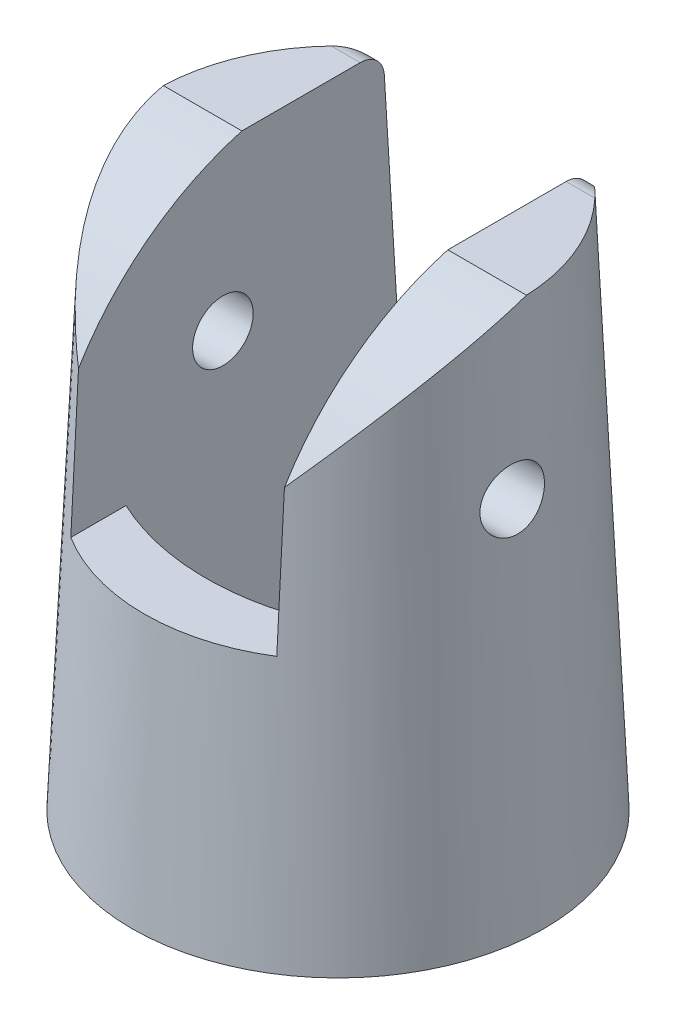
ISO-10303-21;
HEADER;
FILE_DESCRIPTION(('STEP AP214'),'2;1');
FILE_NAME('part.step','',(''),(''),'','','');
FILE_SCHEMA(('AUTOMOTIVE_DESIGN { 1 0 10303 214 1 1 1 1 }'));
ENDSEC;
DATA;
#1=APPLICATION_CONTEXT('core data for automotive mechanical design processes');
#2=APPLICATION_PROTOCOL_DEFINITION('international standard','automotive_design',2000,#1);
#3=PRODUCT_CONTEXT('',#1,'mechanical');
#4=PRODUCT('Part','Part','',(#3));
#5=PRODUCT_RELATED_PRODUCT_CATEGORY('part','',(#4));
#6=PRODUCT_DEFINITION_FORMATION('','',#4);
#7=PRODUCT_DEFINITION_CONTEXT('part definition',#1,'design');
#8=PRODUCT_DEFINITION('design','',#6,#7);
#9=PRODUCT_DEFINITION_SHAPE('','',#8);
#10=(LENGTH_UNIT() NAMED_UNIT(*) SI_UNIT(.MILLI.,.METRE.));
#11=(NAMED_UNIT(*) PLANE_ANGLE_UNIT() SI_UNIT($,.RADIAN.));
#12=(NAMED_UNIT(*) SI_UNIT($,.STERADIAN.) SOLID_ANGLE_UNIT());
#13=UNCERTAINTY_MEASURE_WITH_UNIT(LENGTH_MEASURE(1.E-05),#10,'distance_accuracy_value','');
#14=(GEOMETRIC_REPRESENTATION_CONTEXT(3) GLOBAL_UNCERTAINTY_ASSIGNED_CONTEXT((#13)) GLOBAL_UNIT_ASSIGNED_CONTEXT((#10,
#11,#12)) REPRESENTATION_CONTEXT('',''));
#15=CARTESIAN_POINT('',(0.,0.,0.));
#16=DIRECTION('',(0.,0.,1.));
#17=DIRECTION('',(1.,0.,0.));
#18=AXIS2_PLACEMENT_3D('',#15,#16,#17);
#19=CARTESIAN_POINT('',(-4.25,11.,10.));
#20=DIRECTION('',(0.,1.,0.));
#21=DIRECTION('',(0.,0.,1.));
#22=AXIS2_PLACEMENT_3D('',#19,#20,#21);
#23=PLANE('',#22);
#24=CARTESIAN_POINT('',(0.,11.,-4.55193349511584));
#25=DIRECTION('',(0.,1.,0.));
#26=DIRECTION('',(0.,0.,1.));
#27=AXIS2_PLACEMENT_3D('',#24,#25,#26);
#28=CIRCLE('',#27,10.);
#29=CARTESIAN_POINT('',(-4.25,11.,4.5));
#30=VERTEX_POINT('',#29);
#31=CARTESIAN_POINT('',(4.25,11.,4.5));
#32=VERTEX_POINT('',#31);
#33=EDGE_CURVE('E168',#30,#32,#28,.T.);
#34=ORIENTED_EDGE('',*,*,#33,.F.);
#35=DIRECTION('',(0.,0.,-1.));
#36=VECTOR('',#35,1.);
#37=CARTESIAN_POINT('',(-4.25,11.,10.));
#38=LINE('',#37,#36);
#39=CARTESIAN_POINT('',(-4.25,11.,6.77772085586298));
#40=VERTEX_POINT('',#39);
#41=EDGE_CURVE('E232',#40,#30,#38,.T.);
#42=ORIENTED_EDGE('',*,*,#41,.F.);
#43=CARTESIAN_POINT('',(0.,11.,0.));
#44=DIRECTION('',(0.,1.,0.));
#45=DIRECTION('',(0.,0.,1.));
#46=AXIS2_PLACEMENT_3D('',#43,#44,#45);
#47=CIRCLE('',#46,8.);
#48=CARTESIAN_POINT('',(4.25,11.,6.77772085586298));
#49=VERTEX_POINT('',#48);
#50=EDGE_CURVE('E339',#49,#40,#47,.F.);
#51=ORIENTED_EDGE('',*,*,#50,.F.);
#52=DIRECTION('',(0.,0.,-1.));
#53=VECTOR('',#52,1.);
#54=CARTESIAN_POINT('',(4.25,11.,10.));
#55=LINE('',#54,#53);
#56=EDGE_CURVE('E228',#49,#32,#55,.T.);
#57=ORIENTED_EDGE('',*,*,#56,.T.);
#58=EDGE_LOOP('',(#34,#42,#51,#57));
#59=FACE_BOUND('',#58,.T.);
#60=ADVANCED_FACE('F36',(#59),#23,.T.);
#61=CARTESIAN_POINT('',(0.,22.,0.));
#62=DIRECTION('',(0.,1.,0.));
#63=DIRECTION('',(0.,0.,1.));
#64=AXIS2_PLACEMENT_3D('',#61,#62,#63);
#65=PLANE('',#64);
#66=DIRECTION('',(0.,0.,-1.));
#67=VECTOR('',#66,1.);
#68=CARTESIAN_POINT('',(-4.25,22.,0.));
#69=LINE('',#68,#67);
#70=CARTESIAN_POINT('',(-4.25,22.,-0.282780766378372));
#71=VERTEX_POINT('',#70);
#72=CARTESIAN_POINT('',(-4.25,22.,-5.16422596730198));
#73=VERTEX_POINT('',#72);
#74=EDGE_CURVE('E242',#71,#73,#69,.T.);
#75=ORIENTED_EDGE('',*,*,#74,.T.);
#76=DIRECTION('',(1.,0.,0.));
#77=VECTOR('',#76,1.);
#78=CARTESIAN_POINT('',(-4.35658145321195,22.,-5.16422596730198));
#79=LINE('',#78,#77);
#80=CARTESIAN_POINT('',(-5.438821816591,22.,-5.16422557510443));
#81=VERTEX_POINT('',#80);
#82=EDGE_CURVE('E12',#73,#81,#79,.F.);
#83=ORIENTED_EDGE('',*,*,#82,.T.);
#84=CARTESIAN_POINT('',(0.,22.,0.));
#85=DIRECTION('',(0.,1.,0.));
#86=DIRECTION('',(0.,0.,1.));
#87=AXIS2_PLACEMENT_3D('',#84,#85,#86);
#88=CIRCLE('',#87,7.5);
#89=CARTESIAN_POINT('',(-7.49466710656093,22.,-0.282780766378366));
#90=VERTEX_POINT('',#89);
#91=EDGE_CURVE('E265',#81,#90,#88,.T.);
#92=ORIENTED_EDGE('',*,*,#91,.T.);
#93=DIRECTION('',(-1.,0.,0.));
#94=VECTOR('',#93,1.);
#95=CARTESIAN_POINT('',(10.,22.,-0.282780766378372));
#96=LINE('',#95,#94);
#97=EDGE_CURVE('E222',#71,#90,#96,.T.);
#98=ORIENTED_EDGE('',*,*,#97,.F.);
#99=EDGE_LOOP('',(#75,#83,#92,#98));
#100=FACE_BOUND('',#99,.T.);
#101=ADVANCED_FACE('F300',(#100),#65,.T.);
#102=CARTESIAN_POINT('',(7.49466710656093,22.,-0.282780766378372));
#103=VERTEX_POINT('',#102);
#104=CARTESIAN_POINT('',(5.43882208829554,22.,-5.16422548309984));
#105=VERTEX_POINT('',#104);
#106=EDGE_CURVE('E261',#103,#105,#88,.T.);
#107=ORIENTED_EDGE('',*,*,#106,.T.);
#108=DIRECTION('',(1.,0.,0.));
#109=VECTOR('',#108,1.);
#110=CARTESIAN_POINT('',(4.25,22.,-5.16422596730198));
#111=LINE('',#110,#109);
#112=CARTESIAN_POINT('',(4.25,22.,-5.16422596730198));
#113=VERTEX_POINT('',#112);
#114=EDGE_CURVE('E249',#105,#113,#111,.F.);
#115=ORIENTED_EDGE('',*,*,#114,.T.);
#116=DIRECTION('',(0.,0.,1.));
#117=VECTOR('',#116,1.);
#118=CARTESIAN_POINT('',(4.25,22.,0.));
#119=LINE('',#118,#117);
#120=CARTESIAN_POINT('',(4.25,22.,-0.282780766378372));
#121=VERTEX_POINT('',#120);
#122=EDGE_CURVE('E234',#113,#121,#119,.T.);
#123=ORIENTED_EDGE('',*,*,#122,.T.);
#124=DIRECTION('',(-1.,0.,0.));
#125=VECTOR('',#124,1.);
#126=CARTESIAN_POINT('',(10.,22.,-0.282780766378372));
#127=LINE('',#126,#125);
#128=EDGE_CURVE('E184',#103,#121,#127,.T.);
#129=ORIENTED_EDGE('',*,*,#128,.F.);
#130=EDGE_LOOP('',(#107,#115,#123,#129));
#131=FACE_BOUND('',#130,.T.);
#132=ADVANCED_FACE('F306',(#131),#65,.T.);
#133=CARTESIAN_POINT('',(0.,22.,0.));
#134=DIRECTION('',(0.,-1.,0.));
#135=DIRECTION('',(0.,0.,-1.));
#136=AXIS2_PLACEMENT_3D('',#133,#134,#135);
#137=CONICAL_SURFACE('',#136,7.5,0.0454232794215771);
#138=CARTESIAN_POINT('',(-7.83796735688722,14.3622174893562,-0.379967166316534));
#139=CARTESIAN_POINT('',(-7.84258137245685,14.3133454888,-0.330657672658893));
#140=CARTESIAN_POINT('',(-7.84674066486493,14.2685433740009,-0.277221256144544));
#141=CARTESIAN_POINT('',(-7.8535770197042,14.1883770300518,-0.163551374229647));
#142=CARTESIAN_POINT('',(-7.85625291943775,14.1530202154338,-0.103312621478255));
#143=CARTESIAN_POINT('',(-7.8596375423327,14.0927931436459,0.0222748852102689));
#144=CARTESIAN_POINT('',(-7.86034581452373,14.067925291601,0.0876248070735859));
#145=CARTESIAN_POINT('',(-7.85946228431654,14.0294247957157,0.221525428298114));
#146=CARTESIAN_POINT('',(-7.85787100492778,14.0157895982304,0.290075396410402));
#147=CARTESIAN_POINT('',(-7.85228410719661,14.0001840444117,0.427766064798723));
#148=CARTESIAN_POINT('',(-7.84831020572619,13.9981100486801,0.496895934210147));
#149=CARTESIAN_POINT('',(-7.83806545214515,14.0053392217948,0.634384128941268));
#150=CARTESIAN_POINT('',(-7.83179450336468,14.014642869501,0.702742421664802));
#151=CARTESIAN_POINT('',(-7.81722601313375,14.0443276298967,0.837049248229589));
#152=CARTESIAN_POINT('',(-7.80892100022893,14.0647499293699,0.902987843329569));
#153=CARTESIAN_POINT('',(-7.790775888944,14.1160446525726,1.03043929857791));
#154=CARTESIAN_POINT('',(-7.78093560413196,14.1469183459746,1.09195161990537));
#155=CARTESIAN_POINT('',(-7.76010966108363,14.2190054175936,1.21024682770151));
#156=CARTESIAN_POINT('',(-7.74910385329152,14.2604277357386,1.26689885331061));
#157=CARTESIAN_POINT('',(-7.72687097524336,14.3521248730564,1.37247369304183));
#158=CARTESIAN_POINT('',(-7.71564387723456,14.4024008089463,1.42139553066781));
#159=CARTESIAN_POINT('',(-7.69356264148555,14.5114011926656,1.51095465792816));
#160=CARTESIAN_POINT('',(-7.68271790805299,14.5702531136188,1.55143935878097));
#161=CARTESIAN_POINT('',(-7.6623986074272,14.6941689491704,1.62188693084612));
#162=CARTESIAN_POINT('',(-7.65292397084745,14.7592325489103,1.65185033500368));
#163=CARTESIAN_POINT('',(-7.63612434840078,14.8931135922155,1.70006025493109));
#164=CARTESIAN_POINT('',(-7.628779504597,14.9618887622122,1.71841702637262));
#165=CARTESIAN_POINT('',(-7.61663038843077,15.1017712667087,1.74320996212474));
#166=CARTESIAN_POINT('',(-7.61182564575986,15.1728781668894,1.74964833372071));
#167=CARTESIAN_POINT('',(-7.60511802104365,15.3134015003158,1.75031471224994));
#168=CARTESIAN_POINT('',(-7.60314193334666,15.3828130458677,1.74486034008846));
#169=CARTESIAN_POINT('',(-7.60185272747497,15.5197905645542,1.72250877153392));
#170=CARTESIAN_POINT('',(-7.60253942022953,15.5873566683814,1.70561238765126));
#171=CARTESIAN_POINT('',(-7.60630351713635,15.7179091624343,1.66114648990012));
#172=CARTESIAN_POINT('',(-7.60935259794971,15.7809402068652,1.63370535133399));
#173=CARTESIAN_POINT('',(-7.61736988938797,15.9015696424095,1.5689454281796));
#174=CARTESIAN_POINT('',(-7.62233823791652,15.9591676427765,1.53162593387021));
#175=CARTESIAN_POINT('',(-7.63370221314921,16.0681355426512,1.44760265700419));
#176=CARTESIAN_POINT('',(-7.64011600940821,16.1194120265777,1.40078023978353));
#177=CARTESIAN_POINT('',(-7.65367838854403,16.2134837982302,1.29936472333884));
#178=CARTESIAN_POINT('',(-7.66082704856748,16.2562781941154,1.24477080802427));
#179=CARTESIAN_POINT('',(-7.67534091282203,16.3329515652811,1.12822611342176));
#180=CARTESIAN_POINT('',(-7.68270769514751,16.3666553047501,1.06616013918209));
#181=CARTESIAN_POINT('',(-7.69691604657131,16.423165976049,0.937193488415529));
#182=CARTESIAN_POINT('',(-7.70375760872745,16.4459727638678,0.870292748007196));
#183=CARTESIAN_POINT('',(-7.71644262030627,16.4800561197651,0.73334943158845));
#184=CARTESIAN_POINT('',(-7.72228364732094,16.4913050247458,0.663299734651518));
#185=CARTESIAN_POINT('',(-7.73262752673949,16.5018027282445,0.522209650757891));
#186=CARTESIAN_POINT('',(-7.73713045599583,16.5010522160741,0.451169320942772));
#187=CARTESIAN_POINT('',(-7.74464533464226,16.4875918161016,0.310815334039046));
#188=CARTESIAN_POINT('',(-7.74767065771755,16.4749923395032,0.241491793203629));
#189=CARTESIAN_POINT('',(-7.7523770032345,16.4383254425338,0.105900144542275));
#190=CARTESIAN_POINT('',(-7.75405805542838,16.4142582759914,0.0396319691237624));
#191=CARTESIAN_POINT('',(-7.75633448543182,16.3554710465647,-0.0876438503397964));
#192=CARTESIAN_POINT('',(-7.75693482435448,16.3208005225005,-0.148674301814935));
#193=CARTESIAN_POINT('',(-7.75745954559994,16.2417479395246,-0.264086768502954));
#194=CARTESIAN_POINT('',(-7.75738391180716,16.1973656491035,-0.318468625178237));
#195=CARTESIAN_POINT('',(-7.75702698900383,16.0999847315327,-0.419211339047032));
#196=CARTESIAN_POINT('',(-7.75674504948525,16.0469592633596,-0.465546250063089));
#197=CARTESIAN_POINT('',(-7.75646152768906,15.9338912875552,-0.548673610293639));
#198=CARTESIAN_POINT('',(-7.75645994636058,15.873848756169,-0.585466027202548));
#199=CARTESIAN_POINT('',(-7.75716824579797,15.7483571213731,-0.648511138791821));
#200=CARTESIAN_POINT('',(-7.75787915678735,15.6829003149688,-0.674748494466434));
#201=CARTESIAN_POINT('',(-7.76032771935512,15.5485315888061,-0.715859664595585));
#202=CARTESIAN_POINT('',(-7.76206531536022,15.4796198562436,-0.730734094012506));
#203=CARTESIAN_POINT('',(-7.76670676584568,15.3405207125203,-0.748683187532378));
#204=CARTESIAN_POINT('',(-7.76960720822943,15.2703376022251,-0.751792098543693));
#205=CARTESIAN_POINT('',(-7.77652868962862,15.130481192041,-0.74623974442389));
#206=CARTESIAN_POINT('',(-7.78054994377231,15.0608079926616,-0.737576218456636));
#207=CARTESIAN_POINT('',(-7.78948146542229,14.9238460238463,-0.708730903239069));
#208=CARTESIAN_POINT('',(-7.79439304167692,14.8565609413452,-0.688532062131407));
#209=CARTESIAN_POINT('',(-7.80469362494343,14.7263866758636,-0.637196842199327));
#210=CARTESIAN_POINT('',(-7.8100822334847,14.6634939010552,-0.606069528773817));
#211=CARTESIAN_POINT('',(-7.8193813436165,14.5597286320879,-0.543391023811535));
#212=CARTESIAN_POINT('',(-7.82330433193733,14.5174439551711,-0.514147846605545));
#213=CARTESIAN_POINT('',(-7.83089031896814,14.4367692624713,-0.450678665707523));
#214=CARTESIAN_POINT('',(-7.83455331694851,14.3983792576176,-0.416452648032943));
#215=CARTESIAN_POINT('',(-7.83796735688722,14.3622174893562,-0.379967166316534));
#216=B_SPLINE_CURVE_WITH_KNOTS('',3,(#138,#139,#140,#141,#142,#143,#144,#145,#146,#147,#148,
#149,#150,#151,#152,#153,#154,#155,#156,#157,#158,#159,#160,#161,#162,#163,#164,#165,#166,#167,
#168,#169,#170,#171,#172,#173,#174,#175,#176,#177,#178,#179,#180,#181,#182,#183,#184,#185,#186,
#187,#188,#189,#190,#191,#192,#193,#194,#195,#196,#197,#198,#199,#200,#201,#202,#203,#204,#205,
#206,#207,#208,#209,#210,#211,#212,#213,#214,#215),.UNSPECIFIED.,.T.,.F.,(4,2,2,2,2,2,2,2,2,2,2,
2,2,2,2,2,2,2,2,2,2,2,2,2,2,2,2,2,2,2,2,2,2,2,2,2,2,2,4),(0.,0.208553037536982,
0.417269310681503,0.626033416602672,0.834750048737337,1.04159261254212,1.24844388219199,
1.45606665596537,1.66371466154781,1.87584802928522,2.08800817283941,2.30372407188203,
2.5194290424861,2.73305288682505,2.94663716410913,3.1545872325207,3.36252253570734,
3.56800270522751,3.77349764170112,3.98173607251478,4.18999638674758,4.40202316410761,
4.61405274347573,4.82658862900881,5.03911230536931,5.24967505863844,5.46023315147819,
5.66982216909493,5.87941618344591,6.08967393764611,6.29993240365298,6.51049533073528,
6.72104686132943,6.93098504794489,7.14096355781078,7.3512532707934,7.56136895456365,
7.7156827817969,7.86999704206467),.UNSPECIFIED.);
#217=CARTESIAN_POINT('',(-7.83796735688722,14.3622174893562,-0.379967166316534));
#218=VERTEX_POINT('',#217);
#219=EDGE_CURVE('E516',#218,#218,#216,.T.);
#220=ORIENTED_EDGE('',*,*,#219,.F.);
#221=EDGE_LOOP('',(#220));
#222=FACE_BOUND('',#221,.T.);
#223=CARTESIAN_POINT('',(7.83796735688722,14.3622174893562,-0.379967166316534));
#224=CARTESIAN_POINT('',(7.83328744997076,14.411786493911,-0.429972551895008));
#225=CARTESIAN_POINT('',(7.82813491145327,14.4655970435523,-0.475788374346395));
#226=CARTESIAN_POINT('',(7.81750342359286,14.5801753249335,-0.557736154925303));
#227=CARTESIAN_POINT('',(7.81202413824418,14.6409502797276,-0.593857926863399));
#228=CARTESIAN_POINT('',(7.80132350845169,14.7677115943127,-0.655359958784006));
#229=CARTESIAN_POINT('',(7.79610206849342,14.8336960004513,-0.68074422306178));
#230=CARTESIAN_POINT('',(7.78639291034306,14.9690294601727,-0.720049024368096));
#231=CARTESIAN_POINT('',(7.78190500745661,15.0383776610788,-0.733972450649715));
#232=CARTESIAN_POINT('',(7.77399091836468,15.1783689326216,-0.749929222930623));
#233=CARTESIAN_POINT('',(7.77056291818221,15.2490095693085,-0.751982991142016));
#234=CARTESIAN_POINT('',(7.76489197262361,15.3896780692755,-0.744167192422135));
#235=CARTESIAN_POINT('',(7.76264903265032,15.4597059297606,-0.73429757113135));
#236=CARTESIAN_POINT('',(7.75929248978818,15.5967220156707,-0.702993570327684));
#237=CARTESIAN_POINT('',(7.75817236040506,15.6637256196513,-0.681627146744598));
#238=CARTESIAN_POINT('',(7.75679365361985,15.7932173640281,-0.627974577793197));
#239=CARTESIAN_POINT('',(7.75653508331722,15.8557054672114,-0.5956883424456));
#240=CARTESIAN_POINT('',(7.75649444526569,15.9744166240331,-0.521095827758257));
#241=CARTESIAN_POINT('',(7.7567125622039,16.0306372405351,-0.478785670425266));
#242=CARTESIAN_POINT('',(7.75715624655791,16.1351989223126,-0.38534680301936));
#243=CARTESIAN_POINT('',(7.75738181406936,16.1835398863793,-0.334217979693814));
#244=CARTESIAN_POINT('',(7.75735277244982,16.2710823014537,-0.224452008036307));
#245=CARTESIAN_POINT('',(7.75709699967637,16.31026134601,-0.165796984553421));
#246=CARTESIAN_POINT('',(7.75566157635508,16.3782114671868,-0.0427503856031519));
#247=CARTESIAN_POINT('',(7.75448195024235,16.406982819052,0.0216410381015896));
#248=CARTESIAN_POINT('',(7.75087513937824,16.4532417161059,0.154138010703878));
#249=CARTESIAN_POINT('',(7.74845117341741,16.4707581130484,0.222233573597008));
#250=CARTESIAN_POINT('',(7.74219359590397,16.4941450998807,0.360331220773845));
#251=CARTESIAN_POINT('',(7.73836001268759,16.5000159238554,0.430333266707118));
#252=CARTESIAN_POINT('',(7.72932068479677,16.4999840438097,0.570093595387191));
#253=CARTESIAN_POINT('',(7.72411787249586,16.4941063254208,0.639852080057968));
#254=CARTESIAN_POINT('',(7.71255950790742,16.4708408417028,0.777323498526293));
#255=CARTESIAN_POINT('',(7.70620390189043,16.4534525397877,0.845036336808613));
#256=CARTESIAN_POINT('',(7.69269658051719,16.4075370442686,0.976990666341749));
#257=CARTESIAN_POINT('',(7.68553992325761,16.3789376360297,1.04120651486163));
#258=CARTESIAN_POINT('',(7.67101803808324,16.3114123472423,1.16393536511896));
#259=CARTESIAN_POINT('',(7.66365279507404,16.2724857176454,1.22244795276949));
#260=CARTESIAN_POINT('',(7.64930430545073,16.1849979103186,1.33262702154622));
#261=CARTESIAN_POINT('',(7.64232472712915,16.1363596199086,1.38423279897497));
#262=CARTESIAN_POINT('',(7.62951784340339,16.0309808458313,1.4785542987219));
#263=CARTESIAN_POINT('',(7.62369050222643,15.9742406137942,1.52127029703761));
#264=CARTESIAN_POINT('',(7.61388677149647,15.8546071582144,1.59631412815498));
#265=CARTESIAN_POINT('',(7.60989910971896,15.7917543426828,1.62870483824421));
#266=CARTESIAN_POINT('',(7.60426405732497,15.6614026873648,1.68246189666889));
#267=CARTESIAN_POINT('',(7.60261632102336,15.5939045353947,1.70382987313305));
#268=CARTESIAN_POINT('',(7.60201413428632,15.4576064065578,1.73457894238311));
#269=CARTESIAN_POINT('',(7.60300775882109,15.3888575301053,1.74418579213573));
#270=CARTESIAN_POINT('',(7.60767099089208,15.2508115759145,1.75190966695364));
#271=CARTESIAN_POINT('',(7.61134043696361,15.1815145315033,1.75002738524674));
#272=CARTESIAN_POINT('',(7.62115557547188,15.0449328497942,1.73496140239145));
#273=CARTESIAN_POINT('',(7.62728047676171,14.9776362883151,1.72187156798986));
#274=CARTESIAN_POINT('',(7.6416294406344,14.8462855334842,1.68497664018864));
#275=CARTESIAN_POINT('',(7.64985369677373,14.7822316397532,1.66117055861715));
#276=CARTESIAN_POINT('',(7.66801243401358,14.6579498642628,1.6030701895091));
#277=CARTESIAN_POINT('',(7.6779742216434,14.5978081122334,1.56860035291659));
#278=CARTESIAN_POINT('',(7.69881665045785,14.4841316963163,1.49030840998256));
#279=CARTESIAN_POINT('',(7.70969743522397,14.4305980680908,1.44648484060131));
#280=CARTESIAN_POINT('',(7.73191396506617,14.3302369345709,1.34942943943223));
#281=CARTESIAN_POINT('',(7.74325425905537,14.2836130542963,1.29598786361171));
#282=CARTESIAN_POINT('',(7.76532822275802,14.200004007431,1.18191600547704));
#283=CARTESIAN_POINT('',(7.77606186415307,14.1630192905038,1.12128538798862));
#284=CARTESIAN_POINT('',(7.79623886870943,14.0996284747101,0.994176429544855));
#285=CARTESIAN_POINT('',(7.80567632874684,14.073269780279,0.927673462984205));
#286=CARTESIAN_POINT('',(7.82259046158376,14.0322318910173,0.790920827608197));
#287=CARTESIAN_POINT('',(7.83006744861704,14.017550823674,0.720671761410059));
#288=CARTESIAN_POINT('',(7.84250930031314,14.0005847034211,0.579912298187302));
#289=CARTESIAN_POINT('',(7.84752147606881,13.9980572854591,0.509435309955935));
#290=CARTESIAN_POINT('',(7.85506980203676,14.0049041647396,0.3689156843286));
#291=CARTESIAN_POINT('',(7.85760577766391,14.0142793010676,0.298873077904731));
#292=CARTESIAN_POINT('',(7.86022591507369,14.0444071543172,0.162619905603529));
#293=CARTESIAN_POINT('',(7.86035508572819,14.0649435994135,0.096362149741156));
#294=CARTESIAN_POINT('',(7.85853055532961,14.1166536842147,-0.0317812303583431));
#295=CARTESIAN_POINT('',(7.85657877647283,14.1478174892377,-0.0936708332501011));
#296=CARTESIAN_POINT('',(7.85185318686241,14.2090525709101,-0.193735923866125));
#297=CARTESIAN_POINT('',(7.84950029916606,14.2366587523309,-0.233464626389801));
#298=CARTESIAN_POINT('',(7.844161430126,14.2962513658329,-0.309440878422375));
#299=CARTESIAN_POINT('',(7.84117544129214,14.3282378497355,-0.345688386738222));
#300=CARTESIAN_POINT('',(7.83796735688722,14.3622174893562,-0.379967166316534));
#301=B_SPLINE_CURVE_WITH_KNOTS('',3,(#223,#224,#225,#226,#227,#228,#229,#230,#231,#232,#233,
#234,#235,#236,#237,#238,#239,#240,#241,#242,#243,#244,#245,#246,#247,#248,#249,#250,#251,#252,
#253,#254,#255,#256,#257,#258,#259,#260,#261,#262,#263,#264,#265,#266,#267,#268,#269,#270,#271,
#272,#273,#274,#275,#276,#277,#278,#279,#280,#281,#282,#283,#284,#285,#286,#287,#288,#289,#290,
#291,#292,#293,#294,#295,#296,#297,#298,#299,#300),.UNSPECIFIED.,.T.,.F.,(4,2,2,2,2,2,2,2,2,2,2,
2,2,2,2,2,2,2,2,2,2,2,2,2,2,2,2,2,2,2,2,2,2,2,2,2,2,2,4),(0.,0.211521205247813,
0.423263807442014,0.634927375558793,0.846537567380181,1.0577835669305,1.26903052956875,
1.47904234258002,1.68905588613143,1.89915081148957,2.10924843516682,2.31985462343067,
2.53045524153484,2.74051381413052,2.95056816434615,3.16017626716106,3.36979414190905,
3.58078503094666,3.79179122764584,4.00454472861511,4.2172916233229,4.4287170558575,
4.6401112505464,4.84738064458982,5.05463753259738,5.26017537178874,5.46573216802022,
5.67487122393724,5.8840430157978,6.09850004920052,6.31296708515513,6.52838057854262,
6.74375952331146,6.95482510378299,7.16590556441396,7.37303463285966,7.57997253949852,
7.72496898140106,7.86996713883852),.UNSPECIFIED.);
#302=CARTESIAN_POINT('',(7.83796735688722,14.3622174893562,-0.379967166316534));
#303=VERTEX_POINT('',#302);
#304=EDGE_CURVE('E510',#303,#303,#301,.T.);
#305=ORIENTED_EDGE('',*,*,#304,.F.);
#306=EDGE_LOOP('',(#305));
#307=FACE_BOUND('',#306,.T.);
#308=CARTESIAN_POINT('',(0.,41.3966504623758,-4.91858206978573));
#309=DIRECTION('',(0.,-0.061048539534854,0.998134798421867));
#310=DIRECTION('',(0.,-0.998134798421867,-0.061048539534854));
#311=AXIS2_PLACEMENT_3D('',#308,#309,#310);
#312=ELLIPSE('',#311,108.411013929554,4.42830625448101);
#313=CARTESIAN_POINT('',(4.34940519150883,21.0610485395348,-6.16236076572385));
#314=VERTEX_POINT('',#313);
#315=CARTESIAN_POINT('',(4.25,11.,-6.77772085586298));
#316=VERTEX_POINT('',#315);
#317=EDGE_CURVE('E170',#314,#316,#312,.F.);
#318=ORIENTED_EDGE('',*,*,#317,.F.);
#319=CARTESIAN_POINT('',(4.34940519150883,21.0610485395349,-6.16236076572385));
#320=CARTESIAN_POINT('',(4.34960668817625,21.0960037714882,-6.16026639709529));
#321=CARTESIAN_POINT('',(4.35255770840583,21.1307027635223,-6.15626033932825));
#322=CARTESIAN_POINT('',(4.36323729220071,21.1984264149009,-6.14492437754313));
#323=CARTESIAN_POINT('',(4.37091464928772,21.2314649684895,-6.13763032047632));
#324=CARTESIAN_POINT('',(4.3927674187493,21.3034159998716,-6.11798905969393));
#325=CARTESIAN_POINT('',(4.40808163224176,21.3417552703831,-6.10483757135849));
#326=CARTESIAN_POINT('',(4.44349099131189,21.4147941627066,-6.07500114310349));
#327=CARTESIAN_POINT('',(4.46360781026385,21.4494762264571,-6.05830022381533));
#328=CARTESIAN_POINT('',(4.51834985809759,21.5317973235916,-6.01298583576456));
#329=CARTESIAN_POINT('',(4.55514250711387,21.5770255303745,-5.98264043640866));
#330=CARTESIAN_POINT('',(4.63324615227983,21.6597061595097,-5.91759225288077));
#331=CARTESIAN_POINT('',(4.67456645627655,21.6971420868919,-5.8828804698848));
#332=CARTESIAN_POINT('',(4.78221980236055,21.7828896509989,-5.79100629877273));
#333=CARTESIAN_POINT('',(4.8503074683537,21.8266110984243,-5.73161575598004));
#334=CARTESIAN_POINT('',(4.98881469902542,21.8995032525744,-5.60704864762353));
#335=CARTESIAN_POINT('',(5.05923576587386,21.9286643838315,-5.54186830754522));
#336=CARTESIAN_POINT('',(5.18172123590552,21.9668930634414,-5.4247129010371));
#337=CARTESIAN_POINT('',(5.23375859656191,21.9792240430582,-5.37375512147988));
#338=CARTESIAN_POINT('',(5.33701405608624,21.9957402272397,-5.27015891537571));
#339=CARTESIAN_POINT('',(5.38823463353786,21.9999585068014,-5.21752820599083));
#340=CARTESIAN_POINT('',(5.43882157834542,21.9999999999995,-5.16422499886717));
#341=B_SPLINE_CURVE_WITH_KNOTS('',3,(#319,#320,#321,#322,#323,#324,#325,#326,#327,#328,#329,
#330,#331,#332,#333,#334,#335,#336,#337,#338,#339,#340),.UNSPECIFIED.,.F.,.F.,(4,2,2,2,2,2,2,2,
2,2,4),(0.,0.104713635229163,0.208312266464569,0.337583019397058,0.467448560866493,
0.663534383733636,0.860031158880604,1.15956187798788,1.45928932231263,1.6804477134348,
1.9007025274968),.UNSPECIFIED.);
#342=EDGE_CURVE('E252',#314,#105,#341,.T.);
#343=ORIENTED_EDGE('',*,*,#342,.T.);
#344=ORIENTED_EDGE('',*,*,#106,.F.);
#345=CARTESIAN_POINT('',(3.92629643649929,16.4998,6.68182888151938));
#346=CARTESIAN_POINT('',(4.01931564514,16.6087596912144,6.62142155513562));
#347=CARTESIAN_POINT('',(4.11131934328455,16.7173930395185,6.55888032044954));
#348=CARTESIAN_POINT('',(4.2932260178552,16.9338412713703,6.42945464521689));
#349=CARTESIAN_POINT('',(4.38312886202439,17.0416561031024,6.36256993222782));
#350=CARTESIAN_POINT('',(4.64974442688335,17.3638214077866,6.15515905521457));
#351=CARTESIAN_POINT('',(4.82317510446661,17.5766708748424,6.00799843905382));
#352=CARTESIAN_POINT('',(5.16169686386746,17.9988471466584,5.69400575303419));
#353=CARTESIAN_POINT('',(5.32669369672939,18.208121685456,5.52700099956619));
#354=CARTESIAN_POINT('',(5.64481535638337,18.6193198754499,5.17407572809778));
#355=CARTESIAN_POINT('',(5.79794544197142,18.8212467614988,4.98816367438537));
#356=CARTESIAN_POINT('',(6.18554186312356,19.344583308023,4.46948304084846));
#357=CARTESIAN_POINT('',(6.40828324022354,19.6584689169281,4.11972189091382));
#358=CARTESIAN_POINT('',(6.70460657922282,20.1030052689049,3.55584345351292));
#359=CARTESIAN_POINT('',(6.79701231639435,20.2466767825226,3.36154965453657));
#360=CARTESIAN_POINT('',(6.96755426977346,20.5240954336224,2.95998057341705));
#361=CARTESIAN_POINT('',(7.04569416904946,20.6578451273514,2.7527086604966));
#362=CARTESIAN_POINT('',(7.17256638181405,20.8899099716306,2.36580838957839));
#363=CARTESIAN_POINT('',(7.22406541289287,20.9901763018322,2.18825189066998));
#364=CARTESIAN_POINT('',(7.31510853322135,21.1822314807992,1.82566056472446));
#365=CARTESIAN_POINT('',(7.35465549431912,21.2740223623616,1.64062754628174));
#366=CARTESIAN_POINT('',(7.42056862050664,21.4481005988231,1.26431410365367));
#367=CARTESIAN_POINT('',(7.44696120414356,21.5304067445339,1.0730470299074));
#368=CARTESIAN_POINT('',(7.48555616887137,21.6848871796944,0.68514833352627));
#369=CARTESIAN_POINT('',(7.49776772335813,21.757067992397,0.48852026316183));
#370=CARTESIAN_POINT('',(7.50462208608418,21.8557629190509,0.195068954102029));
#371=CARTESIAN_POINT('',(7.50510898755003,21.8864428593324,0.0997400677496214));
#372=CARTESIAN_POINT('',(7.50253793378852,21.9452762371562,-0.0915936069798442));
#373=CARTESIAN_POINT('',(7.49948176524655,21.9734309404044,-0.187598030443378));
#374=CARTESIAN_POINT('',(7.49461138166237,22.0003080623876,-0.28388412339532));
#375=B_SPLINE_CURVE_WITH_KNOTS('',3,(#345,#346,#347,#348,#349,#350,#351,#352,#353,#354,#355,
#356,#357,#358,#359,#360,#361,#362,#363,#364,#365,#366,#367,#368,#369,#370,#371,#372,#373,#374),
.UNSPECIFIED.,.F.,.F.,(4,2,2,2,2,2,2,2,2,2,2,2,2,2,4),(0.,0.466403210186573,0.932835703589585,
1.86664716605778,2.8092792869606,3.75149125909967,5.30530822586806,6.08073041777247,
6.85595213185147,7.48631450141871,8.11652528662495,8.74546523819607,9.37399811531518,
9.67435061674296,9.97455172345294),.UNSPECIFIED.);
#376=CARTESIAN_POINT('',(4.25,16.8824851749416,6.45993994327909));
#377=VERTEX_POINT('',#376);
#378=EDGE_CURVE('E182',#377,#103,#375,.T.);
#379=ORIENTED_EDGE('',*,*,#378,.F.);
#380=CARTESIAN_POINT('',(4.24999999999999,28.8057765116834,5.80024977110232));
#381=CARTESIAN_POINT('',(4.24999999999999,26.2989672472569,5.9414803133123));
#382=CARTESIAN_POINT('',(4.25,23.7920608816099,6.08097461329277));
#383=CARTESIAN_POINT('',(4.25,18.7780890989142,6.35703244550604));
#384=CARTESIAN_POINT('',(4.25,16.2710236820206,6.49359598055445));
#385=CARTESIAN_POINT('',(4.25,11.2567649375485,6.76433422535382));
#386=CARTESIAN_POINT('',(4.25,8.74957161001142,6.89850893587335));
#387=CARTESIAN_POINT('',(4.25,3.73507492544163,7.16483292436775));
#388=CARTESIAN_POINT('',(4.25,1.22777156830585,7.29698220040266));
#389=CARTESIAN_POINT('',(4.25,-1.27957505847372,7.42830030504297));
#390=B_SPLINE_CURVE_WITH_KNOTS('',3,(#380,#381,#382,#383,#384,#385,#386,#387,#388,#389),
.UNSPECIFIED.,.F.,.F.,(4,2,2,2,4),(0.,7.5323518408429,15.0646964449593,22.5970386255993,
30.129388020287),.UNSPECIFIED.);
#391=EDGE_CURVE('E344',#377,#49,#390,.T.);
#392=ORIENTED_EDGE('',*,*,#391,.T.);
#393=ORIENTED_EDGE('',*,*,#50,.T.);
#394=CARTESIAN_POINT('',(-4.25,-1.27957505847371,7.42830030504297));
#395=CARTESIAN_POINT('',(-4.25,1.22777156830585,7.29698220040253));
#396=CARTESIAN_POINT('',(-4.25,3.73507492544163,7.16483292436767));
#397=CARTESIAN_POINT('',(-4.25,8.74957161001142,6.89850893587343));
#398=CARTESIAN_POINT('',(-4.25,11.2567649375485,6.764334225354));
#399=CARTESIAN_POINT('',(-4.25,16.2710236820206,6.49359598055463));
#400=CARTESIAN_POINT('',(-4.25,18.7780890989142,6.35703244550611));
#401=CARTESIAN_POINT('',(-4.25,23.7920608816099,6.08097461329268));
#402=CARTESIAN_POINT('',(-4.25000000000001,26.2989672472569,5.94148031331217));
#403=CARTESIAN_POINT('',(-4.25,28.8057765116834,5.80024977110231));
#404=B_SPLINE_CURVE_WITH_KNOTS('',3,(#394,#395,#396,#397,#398,#399,#400,#401,#402,#403),
.UNSPECIFIED.,.F.,.F.,(4,2,2,2,4),(0.,7.53234939468772,15.0646915753277,22.5970361794441,
30.129388020287),.UNSPECIFIED.);
#405=CARTESIAN_POINT('',(-4.25,16.8824851749416,6.45993994327909));
#406=VERTEX_POINT('',#405);
#407=EDGE_CURVE('E337',#40,#406,#404,.T.);
#408=ORIENTED_EDGE('',*,*,#407,.T.);
#409=CARTESIAN_POINT('',(-7.49461138166237,22.0003080623876,-0.28388412339532));
#410=CARTESIAN_POINT('',(-7.49988309951068,21.9712190846278,-0.179671951668641));
#411=CARTESIAN_POINT('',(-7.50302890185525,21.9406327300934,-0.0757903670246975));
#412=CARTESIAN_POINT('',(-7.50517997220749,21.876530339592,0.13109451540663));
#413=CARTESIAN_POINT('',(-7.50418576359576,21.8430146744732,0.234097922563612));
#414=CARTESIAN_POINT('',(-7.49516957751024,21.7382570709262,0.54121921764491));
#415=CARTESIAN_POINT('',(-7.48112808840113,21.6627231332624,0.743739635876401));
#416=CARTESIAN_POINT('',(-7.43828077256935,21.5017611807683,1.14094177768584));
#417=CARTESIAN_POINT('',(-7.40961241381115,21.4164309208909,1.33567859826578));
#418=CARTESIAN_POINT('',(-7.33878245591829,21.2361607157852,1.71816731631631));
#419=CARTESIAN_POINT('',(-7.29661717605367,21.1412181540315,1.90591729280399));
#420=CARTESIAN_POINT('',(-7.20026737266868,20.9431335214884,2.27261940341223));
#421=CARTESIAN_POINT('',(-7.1461407509817,20.8400324372421,2.45160901155736));
#422=CARTESIAN_POINT('',(-7.02698361077534,20.6261840787999,2.80110168903546));
#423=CARTESIAN_POINT('',(-6.96195399000715,20.5154374345796,2.97160545559348));
#424=CARTESIAN_POINT('',(-6.75179546283551,20.1723044580087,3.47084807264812));
#425=CARTESIAN_POINT('',(-6.59184775246264,19.9295259920633,3.78640217377691));
#426=CARTESIAN_POINT('',(-6.27814664729068,19.476767736348,4.31768661392711));
#427=CARTESIAN_POINT('',(-6.13025157024551,19.2707265163302,4.54040677859332));
#428=CARTESIAN_POINT('',(-5.81823735113368,18.8479886062566,4.96354041807549));
#429=CARTESIAN_POINT('',(-5.65410913328027,18.6312859899342,5.16394127976161));
#430=CARTESIAN_POINT('',(-5.31234904088311,18.1896276284259,5.54273628503243));
#431=CARTESIAN_POINT('',(-5.13471803279778,17.9646724132781,5.72113183874884));
#432=CARTESIAN_POINT('',(-4.76799729772391,17.5085184045354,6.05655537735724));
#433=CARTESIAN_POINT('',(-4.57891334851169,17.2773227911971,6.21359400873509));
#434=CARTESIAN_POINT('',(-4.30977503143093,16.9537346128282,6.41700145308093));
#435=CARTESIAN_POINT('',(-4.23399982905615,16.8632054471757,6.47215899836824));
#436=CARTESIAN_POINT('',(-4.08115145722696,16.6817932779821,6.57931295355229));
#437=CARTESIAN_POINT('',(-4.00408158775142,16.5909115269953,6.63131618955329));
#438=CARTESIAN_POINT('',(-3.92629643649941,16.4997999999999,6.68182888151944));
#439=B_SPLINE_CURVE_WITH_KNOTS('',3,(#409,#410,#411,#412,#413,#414,#415,#416,#417,#418,#419,
#420,#421,#422,#423,#424,#425,#426,#427,#428,#429,#430,#431,#432,#433,#434,#435,#436,#437,#438),
.UNSPECIFIED.,.F.,.F.,(4,2,2,2,2,2,2,2,2,2,2,2,2,2,4),(0.,0.324904791494705,0.649768509741711,
1.29859079449086,1.94142458372872,2.58443382900467,3.22439607689719,3.8643056562566,
5.14731722375654,6.15868823098563,7.17062791680593,8.18250272235386,9.19387124187545,
9.58475718585292,9.97476460463198),.UNSPECIFIED.);
#440=EDGE_CURVE('E220',#90,#406,#439,.T.);
#441=ORIENTED_EDGE('',*,*,#440,.F.);
#442=ORIENTED_EDGE('',*,*,#91,.F.);
#443=CARTESIAN_POINT('',(-5.43882140354224,21.9999999999997,-5.16422518296511));
#444=CARTESIAN_POINT('',(-5.40122433759026,21.999988003325,-5.20383005545125));
#445=CARTESIAN_POINT('',(-5.363273983719,21.9976475021436,-5.24307901185124));
#446=CARTESIAN_POINT('',(-5.28693546590571,21.9884676916384,-5.32063117425542));
#447=CARTESIAN_POINT('',(-5.24854721730837,21.9816274974216,-5.35893419269737));
#448=CARTESIAN_POINT('',(-5.17127647154873,21.9635269369551,-5.43467828088518));
#449=CARTESIAN_POINT('',(-5.13239260596844,21.9522280107373,-5.47210873056732));
#450=CARTESIAN_POINT('',(-5.05479542039122,21.9252776384547,-5.54552571918466));
#451=CARTESIAN_POINT('',(-5.01608206782365,21.9096270638205,-5.58151254556044));
#452=CARTESIAN_POINT('',(-4.91611870549029,21.8632611799505,-5.67291560545297));
#453=CARTESIAN_POINT('',(-4.85525150425467,21.8291362822063,-5.72706601404808));
#454=CARTESIAN_POINT('',(-4.73700759106297,21.7490533016696,-5.82992881193552));
#455=CARTESIAN_POINT('',(-4.67961922184138,21.7031377874961,-5.8786598784777));
#456=CARTESIAN_POINT('',(-4.59414942754881,21.619557864228,-5.95022715826893));
#457=CARTESIAN_POINT('',(-4.56374880396903,21.5863107740471,-5.97544919517086));
#458=CARTESIAN_POINT('',(-4.50666004104456,21.5146667784949,-6.02268787020086));
#459=CARTESIAN_POINT('',(-4.47996861603082,21.4762744908226,-6.04470734602655));
#460=CARTESIAN_POINT('',(-4.4376145251762,21.403376261858,-6.07994105728665));
#461=CARTESIAN_POINT('',(-4.4208227260574,21.369953905225,-6.09402052716762));
#462=CARTESIAN_POINT('',(-4.39183504171262,21.3000849240776,-6.11885386930183));
#463=CARTESIAN_POINT('',(-4.37962334642295,21.2636492430545,-6.12961915827847));
#464=CARTESIAN_POINT('',(-4.36374806339614,21.1994932868563,-6.1445024636423));
#465=CARTESIAN_POINT('',(-4.35862572076484,21.1723707491004,-6.14964452883512));
#466=CARTESIAN_POINT('',(-4.35153841039485,21.1172304633356,-6.15772915553273));
#467=CARTESIAN_POINT('',(-4.34959278287488,21.0892082831502,-6.16065818627183));
#468=CARTESIAN_POINT('',(-4.34940519150883,21.0610485395349,-6.16236076572385));
#469=B_SPLINE_CURVE_WITH_KNOTS('',3,(#443,#444,#445,#446,#447,#448,#449,#450,#451,#452,#453,
#454,#455,#456,#457,#458,#459,#460,#461,#462,#463,#464,#465,#466,#467,#468),.UNSPECIFIED.,.F.,
.F.,(4,2,2,2,2,2,2,2,2,2,2,2,4),(0.,0.163752003230833,0.327536218961529,0.492769055887859,
0.657968828250649,0.92206694623714,1.18522465633728,1.33975800572197,1.49415358224955,
1.61364458887856,1.73271924287742,1.81668582207121,1.90116171903801),.UNSPECIFIED.);
#470=CARTESIAN_POINT('',(-4.34940519150883,21.0610485395349,-6.16236076572385));
#471=VERTEX_POINT('',#470);
#472=EDGE_CURVE('E385',#81,#471,#469,.T.);
#473=ORIENTED_EDGE('',*,*,#472,.T.);
#474=CARTESIAN_POINT('',(-4.25,11.,-6.77772085586298));
#475=VERTEX_POINT('',#474);
#476=EDGE_CURVE('E179',#475,#471,#312,.F.);
#477=ORIENTED_EDGE('',*,*,#476,.F.);
#478=EDGE_CURVE('E331',#475,#316,#47,.F.);
#479=ORIENTED_EDGE('',*,*,#478,.T.);
#480=EDGE_LOOP('',(#318,#343,#344,#379,#392,#393,#408,#441,#442,#473,#477,#479));
#481=FACE_BOUND('',#480,.T.);
#482=CARTESIAN_POINT('',(0.,0.,0.));
#483=DIRECTION('',(0.,1.,0.));
#484=DIRECTION('',(0.,0.,1.));
#485=AXIS2_PLACEMENT_3D('',#482,#483,#484);
#486=CIRCLE('',#485,8.5);
#487=CARTESIAN_POINT('',(0.,0.,8.5));
#488=VERTEX_POINT('',#487);
#489=EDGE_CURVE('E264',#488,#488,#486,.T.);
#490=ORIENTED_EDGE('',*,*,#489,.T.);
#491=EDGE_LOOP('',(#490));
#492=FACE_BOUND('',#491,.T.);
#493=ADVANCED_FACE('F194',(#222,#307,#481,#492),#137,.T.);
#494=CARTESIAN_POINT('',(0.,0.,0.));
#495=DIRECTION('',(0.,1.,0.));
#496=DIRECTION('',(0.,0.,1.));
#497=AXIS2_PLACEMENT_3D('',#494,#495,#496);
#498=PLANE('',#497);
#499=DIRECTION('',(0.,0.,-1.));
#500=VECTOR('',#499,1.);
#501=CARTESIAN_POINT('',(-4.25,0.,4.5));
#502=LINE('',#501,#500);
#503=CARTESIAN_POINT('',(-4.25,0.,4.5));
#504=VERTEX_POINT('',#503);
#505=CARTESIAN_POINT('',(-4.25,0.,-4.5));
#506=VERTEX_POINT('',#505);
#507=EDGE_CURVE('E148',#504,#506,#502,.T.);
#508=ORIENTED_EDGE('',*,*,#507,.F.);
#509=CARTESIAN_POINT('',(0.,0.,-4.55193349511584));
#510=DIRECTION('',(0.,-1.,0.));
#511=DIRECTION('',(0.,0.,1.));
#512=AXIS2_PLACEMENT_3D('',#509,#510,#511);
#513=CIRCLE('',#512,10.);
#514=CARTESIAN_POINT('',(4.25,0.,4.5));
#515=VERTEX_POINT('',#514);
#516=EDGE_CURVE('E153',#515,#504,#513,.T.);
#517=ORIENTED_EDGE('',*,*,#516,.F.);
#518=DIRECTION('',(0.,0.,1.));
#519=VECTOR('',#518,1.);
#520=CARTESIAN_POINT('',(4.25,0.,4.5));
#521=LINE('',#520,#519);
#522=CARTESIAN_POINT('',(4.25,0.,-4.5));
#523=VERTEX_POINT('',#522);
#524=EDGE_CURVE('E158',#523,#515,#521,.T.);
#525=ORIENTED_EDGE('',*,*,#524,.F.);
#526=CARTESIAN_POINT('',(0.,0.,4.55193349511584));
#527=DIRECTION('',(0.,-1.,0.));
#528=DIRECTION('',(0.,0.,1.));
#529=AXIS2_PLACEMENT_3D('',#526,#527,#528);
#530=CIRCLE('',#529,10.);
#531=EDGE_CURVE('E137',#506,#523,#530,.T.);
#532=ORIENTED_EDGE('',*,*,#531,.F.);
#533=EDGE_LOOP('',(#508,#517,#525,#532));
#534=FACE_BOUND('',#533,.T.);
#535=ORIENTED_EDGE('',*,*,#489,.F.);
#536=EDGE_LOOP('',(#535));
#537=FACE_BOUND('',#536,.T.);
#538=ADVANCED_FACE('F155',(#534,#537),#498,.F.);
#539=CARTESIAN_POINT('',(-4.25000000000001,35.609106296612,10.));
#540=DIRECTION('',(1.,0.,0.));
#541=DIRECTION('',(0.,1.,0.));
#542=AXIS2_PLACEMENT_3D('',#539,#540,#541);
#543=PLANE('',#542);
#544=CARTESIAN_POINT('',(-4.25000000000001,15.25,0.5));
#545=DIRECTION('',(1.,0.,0.));
#546=DIRECTION('',(0.,1.,0.));
#547=AXIS2_PLACEMENT_3D('',#544,#545,#546);
#548=CIRCLE('',#547,1.25);
#549=CARTESIAN_POINT('',(-4.25000000000001,16.5,0.5));
#550=VERTEX_POINT('',#549);
#551=EDGE_CURVE('E525',#550,#550,#548,.T.);
#552=ORIENTED_EDGE('',*,*,#551,.F.);
#553=EDGE_LOOP('',(#552));
#554=FACE_BOUND('',#553,.T.);
#555=DIRECTION('',(0.,-0.998134798421867,-0.061048539534854));
#556=VECTOR('',#555,1.);
#557=CARTESIAN_POINT('',(-4.25000000000001,36.5397349355926,-5.21564374925335));
#558=LINE('',#557,#556);
#559=CARTESIAN_POINT('',(-4.25,21.0610485395349,-6.16236076572385));
#560=VERTEX_POINT('',#559);
#561=EDGE_CURVE('E173',#560,#475,#558,.T.);
#562=ORIENTED_EDGE('',*,*,#561,.F.);
#563=CARTESIAN_POINT('',(-4.25,21.,-5.16422596730198));
#564=DIRECTION('',(1.,0.,0.));
#565=DIRECTION('',(0.,1.,0.));
#566=AXIS2_PLACEMENT_3D('',#563,#564,#565);
#567=CIRCLE('',#566,1.);
#568=EDGE_CURVE('E46',#560,#73,#567,.T.);
#569=ORIENTED_EDGE('',*,*,#568,.T.);
#570=ORIENTED_EDGE('',*,*,#74,.F.);
#571=CARTESIAN_POINT('',(-4.25,10.9237834170715,-3.37590640366814));
#572=DIRECTION('',(1.,0.,0.));
#573=DIRECTION('',(0.,1.,0.));
#574=AXIS2_PLACEMENT_3D('',#571,#572,#573);
#575=CIRCLE('',#574,11.5);
#576=EDGE_CURVE('E395',#406,#71,#575,.F.);
#577=ORIENTED_EDGE('',*,*,#576,.F.);
#578=ORIENTED_EDGE('',*,*,#407,.F.);
#579=ORIENTED_EDGE('',*,*,#41,.T.);
#580=DIRECTION('',(0.,-1.,0.));
#581=VECTOR('',#580,1.);
#582=CARTESIAN_POINT('',(-4.25,14.,4.5));
#583=LINE('',#582,#581);
#584=EDGE_CURVE('E144',#30,#504,#583,.T.);
#585=ORIENTED_EDGE('',*,*,#584,.T.);
#586=ORIENTED_EDGE('',*,*,#507,.T.);
#587=DIRECTION('',(0.,-1.,0.));
#588=VECTOR('',#587,1.);
#589=CARTESIAN_POINT('',(-4.25,14.,-4.5));
#590=LINE('',#589,#588);
#591=CARTESIAN_POINT('',(-4.25,11.,-4.5));
#592=VERTEX_POINT('',#591);
#593=EDGE_CURVE('E133',#592,#506,#590,.T.);
#594=ORIENTED_EDGE('',*,*,#593,.F.);
#595=EDGE_CURVE('E231',#592,#475,#38,.T.);
#596=ORIENTED_EDGE('',*,*,#595,.T.);
#597=EDGE_LOOP('',(#562,#569,#570,#577,#578,#579,#585,#586,#594,#596));
#598=FACE_BOUND('',#597,.T.);
#599=ADVANCED_FACE('F149',(#554,#598),#543,.T.);
#600=CARTESIAN_POINT('',(0.,11.,4.55193349511584));
#601=DIRECTION('',(0.,1.,0.));
#602=DIRECTION('',(0.,0.,1.));
#603=AXIS2_PLACEMENT_3D('',#600,#601,#602);
#604=CIRCLE('',#603,10.);
#605=CARTESIAN_POINT('',(4.25,11.,-4.5));
#606=VERTEX_POINT('',#605);
#607=EDGE_CURVE('E140',#606,#592,#604,.T.);
#608=ORIENTED_EDGE('',*,*,#607,.F.);
#609=EDGE_CURVE('E225',#606,#316,#55,.T.);
#610=ORIENTED_EDGE('',*,*,#609,.T.);
#611=ORIENTED_EDGE('',*,*,#478,.F.);
#612=ORIENTED_EDGE('',*,*,#595,.F.);
#613=EDGE_LOOP('',(#608,#610,#611,#612));
#614=FACE_BOUND('',#613,.T.);
#615=ADVANCED_FACE('F302',(#614),#23,.T.);
#616=CARTESIAN_POINT('',(4.24999999999999,35.609106296612,10.));
#617=DIRECTION('',(-1.,0.,0.));
#618=DIRECTION('',(0.,-1.,0.));
#619=AXIS2_PLACEMENT_3D('',#616,#617,#618);
#620=PLANE('',#619);
#621=CARTESIAN_POINT('',(4.24999999999999,15.25,0.5));
#622=DIRECTION('',(-1.,0.,0.));
#623=DIRECTION('',(0.,-1.,0.));
#624=AXIS2_PLACEMENT_3D('',#621,#622,#623);
#625=CIRCLE('',#624,1.25);
#626=CARTESIAN_POINT('',(4.24999999999999,14.,0.5));
#627=VERTEX_POINT('',#626);
#628=EDGE_CURVE('E41',#627,#627,#625,.T.);
#629=ORIENTED_EDGE('',*,*,#628,.F.);
#630=EDGE_LOOP('',(#629));
#631=FACE_BOUND('',#630,.T.);
#632=ORIENTED_EDGE('',*,*,#122,.F.);
#633=CARTESIAN_POINT('',(4.25,21.,-5.16422596730198));
#634=DIRECTION('',(-1.,0.,0.));
#635=DIRECTION('',(0.,-1.,0.));
#636=AXIS2_PLACEMENT_3D('',#633,#634,#635);
#637=CIRCLE('',#636,1.);
#638=CARTESIAN_POINT('',(4.25,21.0610485395349,-6.16236076572385));
#639=VERTEX_POINT('',#638);
#640=EDGE_CURVE('E251',#113,#639,#637,.T.);
#641=ORIENTED_EDGE('',*,*,#640,.T.);
#642=DIRECTION('',(0.,0.998134798421867,0.061048539534854));
#643=VECTOR('',#642,1.);
#644=CARTESIAN_POINT('',(4.24999999999999,36.5397349355926,-5.21564374925335));
#645=LINE('',#644,#643);
#646=EDGE_CURVE('E325',#316,#639,#645,.T.);
#647=ORIENTED_EDGE('',*,*,#646,.F.);
#648=ORIENTED_EDGE('',*,*,#609,.F.);
#649=DIRECTION('',(0.,-1.,0.));
#650=VECTOR('',#649,1.);
#651=CARTESIAN_POINT('',(4.25,14.,-4.5));
#652=LINE('',#651,#650);
#653=EDGE_CURVE('E143',#606,#523,#652,.T.);
#654=ORIENTED_EDGE('',*,*,#653,.T.);
#655=ORIENTED_EDGE('',*,*,#524,.T.);
#656=DIRECTION('',(0.,-1.,0.));
#657=VECTOR('',#656,1.);
#658=CARTESIAN_POINT('',(4.25,14.,4.5));
#659=LINE('',#658,#657);
#660=EDGE_CURVE('E163',#32,#515,#659,.T.);
#661=ORIENTED_EDGE('',*,*,#660,.F.);
#662=ORIENTED_EDGE('',*,*,#56,.F.);
#663=ORIENTED_EDGE('',*,*,#391,.F.);
#664=CARTESIAN_POINT('',(4.25,10.9237834170715,-3.37590640366814));
#665=DIRECTION('',(-1.,0.,0.));
#666=DIRECTION('',(0.,-1.,0.));
#667=AXIS2_PLACEMENT_3D('',#664,#665,#666);
#668=CIRCLE('',#667,11.5);
#669=EDGE_CURVE('E330',#121,#377,#668,.F.);
#670=ORIENTED_EDGE('',*,*,#669,.F.);
#671=EDGE_LOOP('',(#632,#641,#647,#648,#654,#655,#661,#662,#663,#670));
#672=FACE_BOUND('',#671,.T.);
#673=ADVANCED_FACE('F208',(#631,#672),#620,.T.);
#674=CARTESIAN_POINT('',(10.,0.453994361216403,-7.42274219285273));
#675=DIRECTION('',(0.,-0.061048539534854,0.998134798421867));
#676=DIRECTION('',(0.,-0.998134798421867,-0.061048539534854));
#677=AXIS2_PLACEMENT_3D('',#674,#675,#676);
#678=PLANE('',#677);
#679=ORIENTED_EDGE('',*,*,#646,.T.);
#680=DIRECTION('',(1.,0.,0.));
#681=VECTOR('',#680,1.);
#682=CARTESIAN_POINT('',(4.35658557531258,21.0610485395349,-6.16236076572385));
#683=LINE('',#682,#681);
#684=EDGE_CURVE('E364',#639,#314,#683,.T.);
#685=ORIENTED_EDGE('',*,*,#684,.T.);
#686=ORIENTED_EDGE('',*,*,#317,.T.);
#687=EDGE_LOOP('',(#679,#685,#686));
#688=FACE_BOUND('',#687,.T.);
#689=ADVANCED_FACE('F204',(#688),#678,.F.);
#690=CARTESIAN_POINT('',(10.,10.9237834170715,-3.37590640366814));
#691=DIRECTION('',(-1.,0.,0.));
#692=DIRECTION('',(0.,0.,1.));
#693=AXIS2_PLACEMENT_3D('',#690,#691,#692);
#694=CYLINDRICAL_SURFACE('',#693,11.5);
#695=ORIENTED_EDGE('',*,*,#128,.T.);
#696=ORIENTED_EDGE('',*,*,#669,.T.);
#697=ORIENTED_EDGE('',*,*,#378,.T.);
#698=EDGE_LOOP('',(#695,#696,#697));
#699=FACE_BOUND('',#698,.T.);
#700=ADVANCED_FACE('F198',(#699),#694,.T.);
#701=ORIENTED_EDGE('',*,*,#476,.T.);
#702=DIRECTION('',(1.,0.,0.));
#703=VECTOR('',#702,1.);
#704=CARTESIAN_POINT('',(-4.25000000000001,21.0610485395349,-6.16236076572385));
#705=LINE('',#704,#703);
#706=EDGE_CURVE('E256',#471,#560,#705,.T.);
#707=ORIENTED_EDGE('',*,*,#706,.T.);
#708=ORIENTED_EDGE('',*,*,#561,.T.);
#709=EDGE_LOOP('',(#701,#707,#708));
#710=FACE_BOUND('',#709,.T.);
#711=ADVANCED_FACE('F203',(#710),#678,.F.);
#712=ORIENTED_EDGE('',*,*,#97,.T.);
#713=ORIENTED_EDGE('',*,*,#440,.T.);
#714=ORIENTED_EDGE('',*,*,#576,.T.);
#715=EDGE_LOOP('',(#712,#713,#714));
#716=FACE_BOUND('',#715,.T.);
#717=ADVANCED_FACE('F206',(#716),#694,.T.);
#718=CARTESIAN_POINT('',(0.,14.,-4.55193349511584));
#719=DIRECTION('',(0.,-1.,0.));
#720=DIRECTION('',(0.,0.,-1.));
#721=AXIS2_PLACEMENT_3D('',#718,#719,#720);
#722=CYLINDRICAL_SURFACE('',#721,10.);
#723=ORIENTED_EDGE('',*,*,#33,.T.);
#724=ORIENTED_EDGE('',*,*,#660,.T.);
#725=ORIENTED_EDGE('',*,*,#516,.T.);
#726=ORIENTED_EDGE('',*,*,#584,.F.);
#727=EDGE_LOOP('',(#723,#724,#725,#726));
#728=FACE_BOUND('',#727,.T.);
#729=ADVANCED_FACE('F296',(#728),#722,.F.);
#730=CARTESIAN_POINT('',(0.,14.,4.55193349511584));
#731=DIRECTION('',(0.,-1.,0.));
#732=DIRECTION('',(0.,0.,-1.));
#733=AXIS2_PLACEMENT_3D('',#730,#731,#732);
#734=CYLINDRICAL_SURFACE('',#733,10.);
#735=ORIENTED_EDGE('',*,*,#607,.T.);
#736=ORIENTED_EDGE('',*,*,#593,.T.);
#737=ORIENTED_EDGE('',*,*,#531,.T.);
#738=ORIENTED_EDGE('',*,*,#653,.F.);
#739=EDGE_LOOP('',(#735,#736,#737,#738));
#740=FACE_BOUND('',#739,.T.);
#741=ADVANCED_FACE('F135',(#740),#734,.F.);
#742=CARTESIAN_POINT('',(10.,21.,-5.16422596730198));
#743=DIRECTION('',(-1.,0.,0.));
#744=DIRECTION('',(0.,0.,1.));
#745=AXIS2_PLACEMENT_3D('',#742,#743,#744);
#746=CYLINDRICAL_SURFACE('',#745,1.);
#747=ORIENTED_EDGE('',*,*,#640,.F.);
#748=ORIENTED_EDGE('',*,*,#114,.F.);
#749=ORIENTED_EDGE('',*,*,#342,.F.);
#750=ORIENTED_EDGE('',*,*,#684,.F.);
#751=EDGE_LOOP('',(#747,#748,#749,#750));
#752=FACE_BOUND('',#751,.T.);
#753=ADVANCED_FACE('F287',(#752),#746,.T.);
#754=CARTESIAN_POINT('',(10.,21.,-5.16422596730198));
#755=DIRECTION('',(-1.,0.,0.));
#756=DIRECTION('',(0.,0.,1.));
#757=AXIS2_PLACEMENT_3D('',#754,#755,#756);
#758=CYLINDRICAL_SURFACE('',#757,1.);
#759=ORIENTED_EDGE('',*,*,#472,.F.);
#760=ORIENTED_EDGE('',*,*,#82,.F.);
#761=ORIENTED_EDGE('',*,*,#568,.F.);
#762=ORIENTED_EDGE('',*,*,#706,.F.);
#763=EDGE_LOOP('',(#759,#760,#761,#762));
#764=FACE_BOUND('',#763,.T.);
#765=ADVANCED_FACE('F38',(#764),#758,.T.);
#766=CARTESIAN_POINT('',(-30.,15.25,0.5));
#767=DIRECTION('',(1.,0.,0.));
#768=DIRECTION('',(0.,0.,-1.));
#769=AXIS2_PLACEMENT_3D('',#766,#767,#768);
#770=CYLINDRICAL_SURFACE('',#769,1.25);
#771=ORIENTED_EDGE('',*,*,#304,.T.);
#772=EDGE_LOOP('',(#771));
#773=FACE_BOUND('',#772,.T.);
#774=ORIENTED_EDGE('',*,*,#628,.T.);
#775=EDGE_LOOP('',(#774));
#776=FACE_BOUND('',#775,.T.);
#777=ADVANCED_FACE('F295',(#773,#776),#770,.F.);
#778=ORIENTED_EDGE('',*,*,#219,.T.);
#779=EDGE_LOOP('',(#778));
#780=FACE_BOUND('',#779,.T.);
#781=ORIENTED_EDGE('',*,*,#551,.T.);
#782=EDGE_LOOP('',(#781));
#783=FACE_BOUND('',#782,.T.);
#784=ADVANCED_FACE('F492',(#780,#783),#770,.F.);
#785=CLOSED_SHELL('',(#60,#101,#132,#493,#538,#599,#615,#673,#689,#700,#711,#717,#729,#741,#753,
#765,#777,#784));
#786=MANIFOLD_SOLID_BREP('B2',#785);
#787=ADVANCED_BREP_SHAPE_REPRESENTATION('',(#18,#786),#14);
#788=SHAPE_DEFINITION_REPRESENTATION(#9,#787);
ENDSEC;
END-ISO-10303-21;
